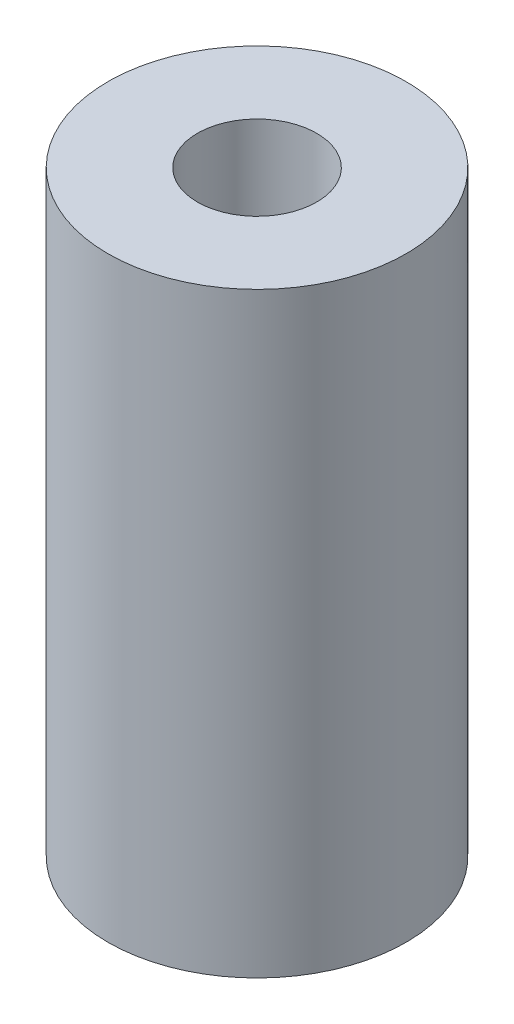
ISO-10303-21;
HEADER;
FILE_DESCRIPTION(('STEP AP214'),'2;1');
FILE_NAME('part.step','',(''),(''),'','','');
FILE_SCHEMA(('AUTOMOTIVE_DESIGN { 1 0 10303 214 1 1 1 1 }'));
ENDSEC;
DATA;
#1=APPLICATION_CONTEXT('core data for automotive mechanical design processes');
#2=APPLICATION_PROTOCOL_DEFINITION('international standard','automotive_design',2000,#1);
#3=PRODUCT_CONTEXT('',#1,'mechanical');
#4=PRODUCT('Part','Part','',(#3));
#5=PRODUCT_RELATED_PRODUCT_CATEGORY('part','',(#4));
#6=PRODUCT_DEFINITION_FORMATION('','',#4);
#7=PRODUCT_DEFINITION_CONTEXT('part definition',#1,'design');
#8=PRODUCT_DEFINITION('design','',#6,#7);
#9=PRODUCT_DEFINITION_SHAPE('','',#8);
#10=(LENGTH_UNIT() NAMED_UNIT(*) SI_UNIT(.MILLI.,.METRE.));
#11=(NAMED_UNIT(*) PLANE_ANGLE_UNIT() SI_UNIT($,.RADIAN.));
#12=(NAMED_UNIT(*) SI_UNIT($,.STERADIAN.) SOLID_ANGLE_UNIT());
#13=UNCERTAINTY_MEASURE_WITH_UNIT(LENGTH_MEASURE(1.E-05),#10,'distance_accuracy_value','');
#14=(GEOMETRIC_REPRESENTATION_CONTEXT(3) GLOBAL_UNCERTAINTY_ASSIGNED_CONTEXT((#13)) GLOBAL_UNIT_ASSIGNED_CONTEXT((#10,
#11,#12)) REPRESENTATION_CONTEXT('',''));
#15=CARTESIAN_POINT('',(0.,0.,0.));
#16=DIRECTION('',(0.,0.,1.));
#17=DIRECTION('',(1.,0.,0.));
#18=AXIS2_PLACEMENT_3D('',#15,#16,#17);
#19=CARTESIAN_POINT('',(0.,20.,0.));
#20=DIRECTION('',(0.,-1.,0.));
#21=DIRECTION('',(0.,0.,-1.));
#22=AXIS2_PLACEMENT_3D('',#19,#20,#21);
#23=CYLINDRICAL_SURFACE('',#22,5.);
#24=CARTESIAN_POINT('',(0.,20.,0.));
#25=DIRECTION('',(0.,1.,0.));
#26=DIRECTION('',(0.,0.,1.));
#27=AXIS2_PLACEMENT_3D('',#24,#25,#26);
#28=CIRCLE('',#27,5.);
#29=CARTESIAN_POINT('',(0.,20.,5.));
#30=VERTEX_POINT('',#29);
#31=EDGE_CURVE('E10',#30,#30,#28,.T.);
#32=ORIENTED_EDGE('',*,*,#31,.F.);
#33=EDGE_LOOP('',(#32));
#34=FACE_BOUND('',#33,.T.);
#35=CARTESIAN_POINT('',(0.,0.,0.));
#36=DIRECTION('',(0.,1.,0.));
#37=DIRECTION('',(0.,0.,1.));
#38=AXIS2_PLACEMENT_3D('',#35,#36,#37);
#39=CIRCLE('',#38,5.);
#40=CARTESIAN_POINT('',(0.,0.,5.));
#41=VERTEX_POINT('',#40);
#42=EDGE_CURVE('E47',#41,#41,#39,.T.);
#43=ORIENTED_EDGE('',*,*,#42,.T.);
#44=EDGE_LOOP('',(#43));
#45=FACE_BOUND('',#44,.T.);
#46=ADVANCED_FACE('F44',(#34,#45),#23,.T.);
#47=CARTESIAN_POINT('',(0.,20.,0.));
#48=DIRECTION('',(0.,1.,0.));
#49=DIRECTION('',(0.,0.,1.));
#50=AXIS2_PLACEMENT_3D('',#47,#48,#49);
#51=PLANE('',#50);
#52=CARTESIAN_POINT('',(0.,20.,0.));
#53=DIRECTION('',(0.,1.,0.));
#54=DIRECTION('',(0.,0.,1.));
#55=AXIS2_PLACEMENT_3D('',#52,#53,#54);
#56=CIRCLE('',#55,2.);
#57=CARTESIAN_POINT('',(0.,20.,2.));
#58=VERTEX_POINT('',#57);
#59=EDGE_CURVE('E59',#58,#58,#56,.T.);
#60=ORIENTED_EDGE('',*,*,#59,.F.);
#61=EDGE_LOOP('',(#60));
#62=FACE_BOUND('',#61,.T.);
#63=ORIENTED_EDGE('',*,*,#31,.T.);
#64=EDGE_LOOP('',(#63));
#65=FACE_BOUND('',#64,.T.);
#66=ADVANCED_FACE('F75',(#62,#65),#51,.T.);
#67=CARTESIAN_POINT('',(0.,0.,0.));
#68=DIRECTION('',(0.,1.,0.));
#69=DIRECTION('',(0.,0.,1.));
#70=AXIS2_PLACEMENT_3D('',#67,#68,#69);
#71=PLANE('',#70);
#72=CARTESIAN_POINT('',(0.,0.,0.));
#73=DIRECTION('',(0.,1.,0.));
#74=DIRECTION('',(0.,0.,1.));
#75=AXIS2_PLACEMENT_3D('',#72,#73,#74);
#76=CIRCLE('',#75,2.);
#77=CARTESIAN_POINT('',(0.,0.,2.));
#78=VERTEX_POINT('',#77);
#79=EDGE_CURVE('E57',#78,#78,#76,.T.);
#80=ORIENTED_EDGE('',*,*,#79,.T.);
#81=EDGE_LOOP('',(#80));
#82=FACE_BOUND('',#81,.T.);
#83=ORIENTED_EDGE('',*,*,#42,.F.);
#84=EDGE_LOOP('',(#83));
#85=FACE_BOUND('',#84,.T.);
#86=ADVANCED_FACE('F66',(#82,#85),#71,.F.);
#87=CARTESIAN_POINT('',(0.,0.,0.));
#88=DIRECTION('',(0.,1.,0.));
#89=DIRECTION('',(0.,0.,1.));
#90=AXIS2_PLACEMENT_3D('',#87,#88,#89);
#91=CYLINDRICAL_SURFACE('',#90,2.);
#92=ORIENTED_EDGE('',*,*,#79,.F.);
#93=EDGE_LOOP('',(#92));
#94=FACE_BOUND('',#93,.T.);
#95=ORIENTED_EDGE('',*,*,#59,.T.);
#96=EDGE_LOOP('',(#95));
#97=FACE_BOUND('',#96,.T.);
#98=ADVANCED_FACE('F69',(#94,#97),#91,.F.);
#99=CLOSED_SHELL('',(#46,#66,#86,#98));
#100=MANIFOLD_SOLID_BREP('B2',#99);
#101=ADVANCED_BREP_SHAPE_REPRESENTATION('',(#18,#100),#14);
#102=SHAPE_DEFINITION_REPRESENTATION(#9,#101);
ENDSEC;
END-ISO-10303-21;
